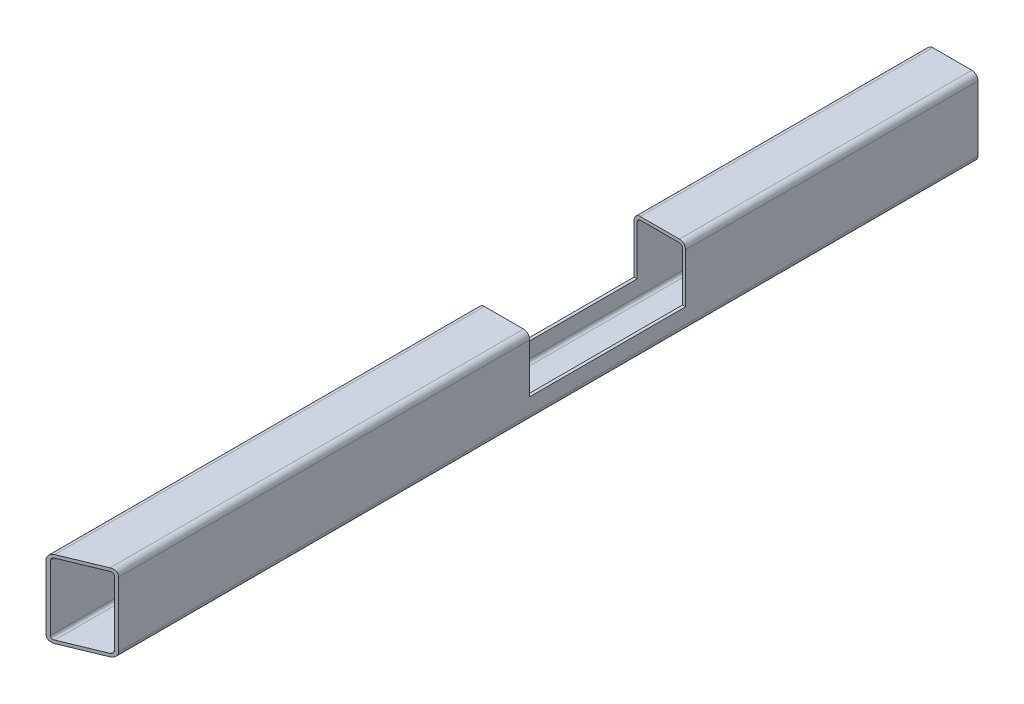
ISO-10303-21;
HEADER;
FILE_DESCRIPTION(('STEP AP214'),'2;1');
FILE_NAME('part.step','',(''),(''),'','','');
FILE_SCHEMA(('AUTOMOTIVE_DESIGN { 1 0 10303 214 1 1 1 1 }'));
ENDSEC;
DATA;
#1=APPLICATION_CONTEXT('core data for automotive mechanical design processes');
#2=APPLICATION_PROTOCOL_DEFINITION('international standard','automotive_design',2000,#1);
#3=PRODUCT_CONTEXT('',#1,'mechanical');
#4=PRODUCT('Part','Part','',(#3));
#5=PRODUCT_RELATED_PRODUCT_CATEGORY('part','',(#4));
#6=PRODUCT_DEFINITION_FORMATION('','',#4);
#7=PRODUCT_DEFINITION_CONTEXT('part definition',#1,'design');
#8=PRODUCT_DEFINITION('design','',#6,#7);
#9=PRODUCT_DEFINITION_SHAPE('','',#8);
#10=(LENGTH_UNIT() NAMED_UNIT(*) SI_UNIT(.MILLI.,.METRE.));
#11=(NAMED_UNIT(*) PLANE_ANGLE_UNIT() SI_UNIT($,.RADIAN.));
#12=(NAMED_UNIT(*) SI_UNIT($,.STERADIAN.) SOLID_ANGLE_UNIT());
#13=UNCERTAINTY_MEASURE_WITH_UNIT(LENGTH_MEASURE(1.E-05),#10,'distance_accuracy_value','');
#14=(GEOMETRIC_REPRESENTATION_CONTEXT(3) GLOBAL_UNCERTAINTY_ASSIGNED_CONTEXT((#13)) GLOBAL_UNIT_ASSIGNED_CONTEXT((#10,
#11,#12)) REPRESENTATION_CONTEXT('',''));
#15=CARTESIAN_POINT('',(0.,0.,0.));
#16=DIRECTION('',(0.,0.,1.));
#17=DIRECTION('',(1.,0.,0.));
#18=AXIS2_PLACEMENT_3D('',#15,#16,#17);
#19=CARTESIAN_POINT('',(56.87568,70.12432,869.95));
#20=DIRECTION('',(0.,0.,-1.));
#21=DIRECTION('',(1.,0.,0.));
#22=AXIS2_PLACEMENT_3D('',#19,#20,#21);
#23=CYLINDRICAL_SURFACE('',#22,6.07568);
#24=DIRECTION('',(0.,0.,-1.));
#25=VECTOR('',#24,1.);
#26=CARTESIAN_POINT('',(56.87568,76.2,869.95));
#27=LINE('',#26,#25);
#28=CARTESIAN_POINT('',(56.8756800000001,76.2,288.925));
#29=VERTEX_POINT('',#28);
#30=CARTESIAN_POINT('',(56.87568,76.2,0.));
#31=VERTEX_POINT('',#30);
#32=EDGE_CURVE('E245',#29,#31,#27,.T.);
#33=ORIENTED_EDGE('',*,*,#32,.T.);
#34=CARTESIAN_POINT('',(56.87568,70.12432,0.));
#35=DIRECTION('',(0.,0.,-1.));
#36=DIRECTION('',(1.,0.,0.));
#37=AXIS2_PLACEMENT_3D('',#34,#35,#36);
#38=CIRCLE('',#37,6.07568);
#39=CARTESIAN_POINT('',(50.8,70.12432,0.));
#40=VERTEX_POINT('',#39);
#41=EDGE_CURVE('E365',#40,#31,#38,.T.);
#42=ORIENTED_EDGE('',*,*,#41,.F.);
#43=DIRECTION('',(0.,0.,-1.));
#44=VECTOR('',#43,1.);
#45=CARTESIAN_POINT('',(50.8,70.12432,869.95));
#46=LINE('',#45,#44);
#47=CARTESIAN_POINT('',(50.8,70.12432,288.925));
#48=VERTEX_POINT('',#47);
#49=EDGE_CURVE('E244',#48,#40,#46,.T.);
#50=ORIENTED_EDGE('',*,*,#49,.F.);
#51=CARTESIAN_POINT('',(56.87568,70.12432,288.925));
#52=DIRECTION('',(0.,0.,1.));
#53=DIRECTION('',(1.,0.,0.));
#54=AXIS2_PLACEMENT_3D('',#51,#52,#53);
#55=CIRCLE('',#54,6.07568);
#56=EDGE_CURVE('E307',#29,#48,#55,.T.);
#57=ORIENTED_EDGE('',*,*,#56,.F.);
#58=EDGE_LOOP('',(#33,#42,#50,#57));
#59=FACE_BOUND('',#58,.T.);
#60=ADVANCED_FACE('F37',(#59),#23,.T.);
#61=CARTESIAN_POINT('',(95.52432,76.2,869.95));
#62=DIRECTION('',(0.,-1.,0.));
#63=DIRECTION('',(0.,0.,-1.));
#64=AXIS2_PLACEMENT_3D('',#61,#62,#63);
#65=PLANE('',#64);
#66=DIRECTION('',(0.,0.,-1.));
#67=VECTOR('',#66,1.);
#68=CARTESIAN_POINT('',(95.52432,76.2,869.95));
#69=LINE('',#68,#67);
#70=CARTESIAN_POINT('',(95.52432,76.2,288.925));
#71=VERTEX_POINT('',#70);
#72=CARTESIAN_POINT('',(95.52432,76.2,0.));
#73=VERTEX_POINT('',#72);
#74=EDGE_CURVE('E379',#71,#73,#69,.T.);
#75=ORIENTED_EDGE('',*,*,#74,.T.);
#76=DIRECTION('',(1.,0.,0.));
#77=VECTOR('',#76,1.);
#78=CARTESIAN_POINT('',(95.52432,76.2,0.));
#79=LINE('',#78,#77);
#80=EDGE_CURVE('E368',#31,#73,#79,.T.);
#81=ORIENTED_EDGE('',*,*,#80,.F.);
#82=ORIENTED_EDGE('',*,*,#32,.F.);
#83=DIRECTION('',(-1.,0.,0.));
#84=VECTOR('',#83,1.);
#85=CARTESIAN_POINT('',(920.75,76.2,288.925));
#86=LINE('',#85,#84);
#87=EDGE_CURVE('E403',#71,#29,#86,.T.);
#88=ORIENTED_EDGE('',*,*,#87,.F.);
#89=EDGE_LOOP('',(#75,#81,#82,#88));
#90=FACE_BOUND('',#89,.T.);
#91=ADVANCED_FACE('F402',(#90),#65,.F.);
#92=CARTESIAN_POINT('',(95.52432,70.12432,869.95));
#93=DIRECTION('',(0.,0.,-1.));
#94=DIRECTION('',(1.,0.,0.));
#95=AXIS2_PLACEMENT_3D('',#92,#93,#94);
#96=CYLINDRICAL_SURFACE('',#95,6.07568);
#97=DIRECTION('',(0.,0.,-1.));
#98=VECTOR('',#97,1.);
#99=CARTESIAN_POINT('',(101.6,70.12432,869.95));
#100=LINE('',#99,#98);
#101=CARTESIAN_POINT('',(101.6,70.12432,288.925));
#102=VERTEX_POINT('',#101);
#103=CARTESIAN_POINT('',(101.6,70.12432,0.));
#104=VERTEX_POINT('',#103);
#105=EDGE_CURVE('E376',#102,#104,#100,.T.);
#106=ORIENTED_EDGE('',*,*,#105,.T.);
#107=CARTESIAN_POINT('',(95.52432,70.12432,0.));
#108=DIRECTION('',(0.,0.,-1.));
#109=DIRECTION('',(1.,0.,0.));
#110=AXIS2_PLACEMENT_3D('',#107,#108,#109);
#111=CIRCLE('',#110,6.07568);
#112=EDGE_CURVE('E371',#73,#104,#111,.T.);
#113=ORIENTED_EDGE('',*,*,#112,.F.);
#114=ORIENTED_EDGE('',*,*,#74,.F.);
#115=CARTESIAN_POINT('',(95.52432,70.12432,288.925));
#116=DIRECTION('',(0.,0.,1.));
#117=DIRECTION('',(1.,0.,0.));
#118=AXIS2_PLACEMENT_3D('',#115,#116,#117);
#119=CIRCLE('',#118,6.07568);
#120=EDGE_CURVE('E305',#102,#71,#119,.T.);
#121=ORIENTED_EDGE('',*,*,#120,.F.);
#122=EDGE_LOOP('',(#106,#113,#114,#121));
#123=FACE_BOUND('',#122,.T.);
#124=ADVANCED_FACE('F387',(#123),#96,.T.);
#125=CARTESIAN_POINT('',(56.87568,70.12432,869.95));
#126=DIRECTION('',(0.,0.,-1.));
#127=DIRECTION('',(1.,0.,0.));
#128=AXIS2_PLACEMENT_3D('',#125,#126,#127);
#129=CYLINDRICAL_SURFACE('',#128,3.03784);
#130=CARTESIAN_POINT('',(56.87568,70.12432,288.925));
#131=DIRECTION('',(0.,0.,1.));
#132=DIRECTION('',(1.,0.,0.));
#133=AXIS2_PLACEMENT_3D('',#130,#131,#132);
#134=CIRCLE('',#133,3.03784);
#135=CARTESIAN_POINT('',(56.87568,73.16216,288.925));
#136=VERTEX_POINT('',#135);
#137=CARTESIAN_POINT('',(53.83784,70.12432,288.925));
#138=VERTEX_POINT('',#137);
#139=EDGE_CURVE('E291',#136,#138,#134,.T.);
#140=ORIENTED_EDGE('',*,*,#139,.T.);
#141=DIRECTION('',(0.,0.,-1.));
#142=VECTOR('',#141,1.);
#143=CARTESIAN_POINT('',(53.83784,70.12432,869.95));
#144=LINE('',#143,#142);
#145=CARTESIAN_POINT('',(53.83784,70.12432,0.));
#146=VERTEX_POINT('',#145);
#147=EDGE_CURVE('E340',#138,#146,#144,.T.);
#148=ORIENTED_EDGE('',*,*,#147,.T.);
#149=CARTESIAN_POINT('',(56.87568,70.12432,0.));
#150=DIRECTION('',(0.,0.,-1.));
#151=DIRECTION('',(1.,0.,0.));
#152=AXIS2_PLACEMENT_3D('',#149,#150,#151);
#153=CIRCLE('',#152,3.03784);
#154=CARTESIAN_POINT('',(56.87568,73.16216,0.));
#155=VERTEX_POINT('',#154);
#156=EDGE_CURVE('E321',#146,#155,#153,.T.);
#157=ORIENTED_EDGE('',*,*,#156,.T.);
#158=DIRECTION('',(0.,0.,-1.));
#159=VECTOR('',#158,1.);
#160=CARTESIAN_POINT('',(56.87568,73.16216,869.95));
#161=LINE('',#160,#159);
#162=EDGE_CURVE('E336',#136,#155,#161,.T.);
#163=ORIENTED_EDGE('',*,*,#162,.F.);
#164=EDGE_LOOP('',(#140,#148,#157,#163));
#165=FACE_BOUND('',#164,.T.);
#166=ADVANCED_FACE('F547',(#165),#129,.F.);
#167=CARTESIAN_POINT('',(95.52432,73.16216,869.95));
#168=DIRECTION('',(0.,-1.,0.));
#169=DIRECTION('',(0.,0.,-1.));
#170=AXIS2_PLACEMENT_3D('',#167,#168,#169);
#171=PLANE('',#170);
#172=DIRECTION('',(-1.,0.,0.));
#173=VECTOR('',#172,1.);
#174=CARTESIAN_POINT('',(95.52432,73.16216,288.925));
#175=LINE('',#174,#173);
#176=CARTESIAN_POINT('',(95.52432,73.16216,288.925));
#177=VERTEX_POINT('',#176);
#178=EDGE_CURVE('E288',#177,#136,#175,.T.);
#179=ORIENTED_EDGE('',*,*,#178,.T.);
#180=ORIENTED_EDGE('',*,*,#162,.T.);
#181=DIRECTION('',(1.,0.,0.));
#182=VECTOR('',#181,1.);
#183=CARTESIAN_POINT('',(95.52432,73.16216,0.));
#184=LINE('',#183,#182);
#185=CARTESIAN_POINT('',(95.52432,73.16216,0.));
#186=VERTEX_POINT('',#185);
#187=EDGE_CURVE('E324',#155,#186,#184,.T.);
#188=ORIENTED_EDGE('',*,*,#187,.T.);
#189=DIRECTION('',(0.,0.,-1.));
#190=VECTOR('',#189,1.);
#191=CARTESIAN_POINT('',(95.52432,73.16216,869.95));
#192=LINE('',#191,#190);
#193=EDGE_CURVE('E332',#177,#186,#192,.T.);
#194=ORIENTED_EDGE('',*,*,#193,.F.);
#195=EDGE_LOOP('',(#179,#180,#188,#194));
#196=FACE_BOUND('',#195,.T.);
#197=ADVANCED_FACE('F549',(#196),#171,.T.);
#198=CARTESIAN_POINT('',(95.52432,70.12432,869.95));
#199=DIRECTION('',(0.,0.,-1.));
#200=DIRECTION('',(1.,0.,0.));
#201=AXIS2_PLACEMENT_3D('',#198,#199,#200);
#202=CYLINDRICAL_SURFACE('',#201,3.03784);
#203=CARTESIAN_POINT('',(95.52432,70.12432,288.925));
#204=DIRECTION('',(0.,0.,1.));
#205=DIRECTION('',(1.,0.,0.));
#206=AXIS2_PLACEMENT_3D('',#203,#204,#205);
#207=CIRCLE('',#206,3.03784);
#208=CARTESIAN_POINT('',(98.56216,70.12432,288.925));
#209=VERTEX_POINT('',#208);
#210=EDGE_CURVE('E279',#209,#177,#207,.T.);
#211=ORIENTED_EDGE('',*,*,#210,.T.);
#212=ORIENTED_EDGE('',*,*,#193,.T.);
#213=CARTESIAN_POINT('',(95.52432,70.12432,0.));
#214=DIRECTION('',(0.,0.,-1.));
#215=DIRECTION('',(1.,0.,0.));
#216=AXIS2_PLACEMENT_3D('',#213,#214,#215);
#217=CIRCLE('',#216,3.03784);
#218=CARTESIAN_POINT('',(98.56216,70.12432,0.));
#219=VERTEX_POINT('',#218);
#220=EDGE_CURVE('E281',#186,#219,#217,.T.);
#221=ORIENTED_EDGE('',*,*,#220,.T.);
#222=DIRECTION('',(0.,0.,-1.));
#223=VECTOR('',#222,1.);
#224=CARTESIAN_POINT('',(98.56216,70.12432,869.95));
#225=LINE('',#224,#223);
#226=EDGE_CURVE('E271',#209,#219,#225,.T.);
#227=ORIENTED_EDGE('',*,*,#226,.F.);
#228=EDGE_LOOP('',(#211,#212,#221,#227));
#229=FACE_BOUND('',#228,.T.);
#230=ADVANCED_FACE('F277',(#229),#202,.F.);
#231=CARTESIAN_POINT('',(95.52432,6.07568,0.));
#232=DIRECTION('',(0.,0.,-1.));
#233=DIRECTION('',(1.,0.,0.));
#234=AXIS2_PLACEMENT_3D('',#231,#232,#233);
#235=PLANE('',#234);
#236=CARTESIAN_POINT('',(95.52432,6.07568,0.));
#237=DIRECTION('',(0.,0.,-1.));
#238=DIRECTION('',(1.,0.,0.));
#239=AXIS2_PLACEMENT_3D('',#236,#237,#238);
#240=CIRCLE('',#239,6.07568);
#241=CARTESIAN_POINT('',(101.6,6.07568000000004,0.));
#242=VERTEX_POINT('',#241);
#243=CARTESIAN_POINT('',(95.52432,0.,0.));
#244=VERTEX_POINT('',#243);
#245=EDGE_CURVE('E350',#242,#244,#240,.T.);
#246=ORIENTED_EDGE('',*,*,#245,.T.);
#247=DIRECTION('',(-1.,0.,0.));
#248=VECTOR('',#247,1.);
#249=CARTESIAN_POINT('',(95.52432,0.,0.));
#250=LINE('',#249,#248);
#251=CARTESIAN_POINT('',(56.87568,0.,0.));
#252=VERTEX_POINT('',#251);
#253=EDGE_CURVE('E357',#244,#252,#250,.T.);
#254=ORIENTED_EDGE('',*,*,#253,.T.);
#255=CARTESIAN_POINT('',(56.87568,6.07568,0.));
#256=DIRECTION('',(0.,0.,-1.));
#257=DIRECTION('',(-1.,0.,0.));
#258=AXIS2_PLACEMENT_3D('',#255,#256,#257);
#259=CIRCLE('',#258,6.07568);
#260=CARTESIAN_POINT('',(50.8,6.07568,0.));
#261=VERTEX_POINT('',#260);
#262=EDGE_CURVE('E360',#252,#261,#259,.T.);
#263=ORIENTED_EDGE('',*,*,#262,.T.);
#264=DIRECTION('',(0.,1.,0.));
#265=VECTOR('',#264,1.);
#266=CARTESIAN_POINT('',(50.8,6.07568000000004,0.));
#267=LINE('',#266,#265);
#268=EDGE_CURVE('E363',#261,#40,#267,.T.);
#269=ORIENTED_EDGE('',*,*,#268,.T.);
#270=ORIENTED_EDGE('',*,*,#41,.T.);
#271=ORIENTED_EDGE('',*,*,#80,.T.);
#272=ORIENTED_EDGE('',*,*,#112,.T.);
#273=DIRECTION('',(0.,-1.,0.));
#274=VECTOR('',#273,1.);
#275=CARTESIAN_POINT('',(101.6,6.07568000000004,0.));
#276=LINE('',#275,#274);
#277=EDGE_CURVE('E354',#104,#242,#276,.T.);
#278=ORIENTED_EDGE('',*,*,#277,.T.);
#279=EDGE_LOOP('',(#246,#254,#263,#269,#270,#271,#272,#278));
#280=FACE_BOUND('',#279,.T.);
#281=DIRECTION('',(0.,-1.,0.));
#282=VECTOR('',#281,1.);
#283=CARTESIAN_POINT('',(98.56216,6.07568000000004,0.));
#284=LINE('',#283,#282);
#285=CARTESIAN_POINT('',(98.56216,6.07568000000004,0.));
#286=VERTEX_POINT('',#285);
#287=EDGE_CURVE('E328',#219,#286,#284,.T.);
#288=ORIENTED_EDGE('',*,*,#287,.F.);
#289=ORIENTED_EDGE('',*,*,#220,.F.);
#290=ORIENTED_EDGE('',*,*,#187,.F.);
#291=ORIENTED_EDGE('',*,*,#156,.F.);
#292=DIRECTION('',(0.,1.,0.));
#293=VECTOR('',#292,1.);
#294=CARTESIAN_POINT('',(53.83784,6.07568000000004,0.));
#295=LINE('',#294,#293);
#296=CARTESIAN_POINT('',(53.83784,6.07568000000004,0.));
#297=VERTEX_POINT('',#296);
#298=EDGE_CURVE('E319',#297,#146,#295,.T.);
#299=ORIENTED_EDGE('',*,*,#298,.F.);
#300=CARTESIAN_POINT('',(56.87568,6.07568,0.));
#301=DIRECTION('',(0.,0.,-1.));
#302=DIRECTION('',(-1.,0.,0.));
#303=AXIS2_PLACEMENT_3D('',#300,#301,#302);
#304=CIRCLE('',#303,3.03784);
#305=CARTESIAN_POINT('',(56.87568,3.03784,0.));
#306=VERTEX_POINT('',#305);
#307=EDGE_CURVE('E316',#306,#297,#304,.T.);
#308=ORIENTED_EDGE('',*,*,#307,.F.);
#309=DIRECTION('',(-1.,0.,0.));
#310=VECTOR('',#309,1.);
#311=CARTESIAN_POINT('',(95.52432,3.03784,0.));
#312=LINE('',#311,#310);
#313=CARTESIAN_POINT('',(95.52432,3.03784,0.));
#314=VERTEX_POINT('',#313);
#315=EDGE_CURVE('E313',#314,#306,#312,.T.);
#316=ORIENTED_EDGE('',*,*,#315,.F.);
#317=CARTESIAN_POINT('',(95.52432,6.07568,0.));
#318=DIRECTION('',(0.,0.,-1.));
#319=DIRECTION('',(1.,0.,0.));
#320=AXIS2_PLACEMENT_3D('',#317,#318,#319);
#321=CIRCLE('',#320,3.03784);
#322=EDGE_CURVE('E310',#286,#314,#321,.T.);
#323=ORIENTED_EDGE('',*,*,#322,.F.);
#324=EDGE_LOOP('',(#288,#289,#290,#291,#299,#308,#316,#323));
#325=FACE_BOUND('',#324,.T.);
#326=ADVANCED_FACE('F396',(#280,#325),#235,.T.);
#327=CARTESIAN_POINT('',(95.52432,6.07568,869.95));
#328=DIRECTION('',(0.,0.,-1.));
#329=DIRECTION('',(1.,0.,0.));
#330=AXIS2_PLACEMENT_3D('',#327,#328,#329);
#331=CYLINDRICAL_SURFACE('',#330,6.07568);
#332=DIRECTION('',(0.,0.,-1.));
#333=VECTOR('',#332,1.);
#334=CARTESIAN_POINT('',(95.52432,0.,869.95));
#335=LINE('',#334,#333);
#336=CARTESIAN_POINT('',(95.5243199999999,0.,851.424580088086));
#337=VERTEX_POINT('',#336);
#338=EDGE_CURVE('E258',#337,#244,#335,.T.);
#339=ORIENTED_EDGE('',*,*,#338,.T.);
#340=ORIENTED_EDGE('',*,*,#245,.F.);
#341=DIRECTION('',(0.,0.,-1.));
#342=VECTOR('',#341,1.);
#343=CARTESIAN_POINT('',(101.6,6.07568000000004,869.95));
#344=LINE('',#343,#342);
#345=CARTESIAN_POINT('',(101.6,6.07568000000004,848.907951031447));
#346=VERTEX_POINT('',#345);
#347=EDGE_CURVE('E353',#346,#242,#344,.T.);
#348=ORIENTED_EDGE('',*,*,#347,.F.);
#349=CARTESIAN_POINT('',(95.52432,6.07568,851.424580088086));
#350=DIRECTION('',(0.382683432365084,0.,0.923879532511289));
#351=DIRECTION('',(0.923879532511289,0.,-0.382683432365084));
#352=AXIS2_PLACEMENT_3D('',#349,#350,#351);
#353=ELLIPSE('',#352,6.57626864347248,6.07568);
#354=EDGE_CURVE('E478',#337,#346,#353,.T.);
#355=ORIENTED_EDGE('',*,*,#354,.F.);
#356=EDGE_LOOP('',(#339,#340,#348,#355));
#357=FACE_BOUND('',#356,.T.);
#358=ADVANCED_FACE('F39',(#357),#331,.T.);
#359=CARTESIAN_POINT('',(95.52432,0.,869.95));
#360=DIRECTION('',(0.,1.,0.));
#361=DIRECTION('',(0.,0.,1.));
#362=AXIS2_PLACEMENT_3D('',#359,#360,#361);
#363=PLANE('',#362);
#364=DIRECTION('',(0.,0.,-1.));
#365=VECTOR('',#364,1.);
#366=CARTESIAN_POINT('',(56.87568,0.,869.95));
#367=LINE('',#366,#365);
#368=CARTESIAN_POINT('',(56.87568,0.,867.433370943361));
#369=VERTEX_POINT('',#368);
#370=EDGE_CURVE('E256',#369,#252,#367,.T.);
#371=ORIENTED_EDGE('',*,*,#370,.T.);
#372=ORIENTED_EDGE('',*,*,#253,.F.);
#373=ORIENTED_EDGE('',*,*,#338,.F.);
#374=DIRECTION('',(0.923879532511289,0.,-0.382683432365084));
#375=VECTOR('',#374,1.);
#376=CARTESIAN_POINT('',(50.8,0.,869.95));
#377=LINE('',#376,#375);
#378=EDGE_CURVE('E229',#369,#337,#377,.T.);
#379=ORIENTED_EDGE('',*,*,#378,.F.);
#380=EDGE_LOOP('',(#371,#372,#373,#379));
#381=FACE_BOUND('',#380,.T.);
#382=ADVANCED_FACE('F503',(#381),#363,.F.);
#383=CARTESIAN_POINT('',(56.87568,6.07568,869.95));
#384=DIRECTION('',(0.,0.,-1.));
#385=DIRECTION('',(1.,0.,0.));
#386=AXIS2_PLACEMENT_3D('',#383,#384,#385);
#387=CYLINDRICAL_SURFACE('',#386,6.07568);
#388=DIRECTION('',(0.,0.,-1.));
#389=VECTOR('',#388,1.);
#390=CARTESIAN_POINT('',(50.8,6.07568,869.95));
#391=LINE('',#390,#389);
#392=CARTESIAN_POINT('',(50.8,6.07568,869.95));
#393=VERTEX_POINT('',#392);
#394=EDGE_CURVE('E254',#393,#261,#391,.T.);
#395=ORIENTED_EDGE('',*,*,#394,.T.);
#396=ORIENTED_EDGE('',*,*,#262,.F.);
#397=ORIENTED_EDGE('',*,*,#370,.F.);
#398=CARTESIAN_POINT('',(56.87568,6.07568,867.433370943361));
#399=DIRECTION('',(0.382683432365084,0.,0.923879532511289));
#400=DIRECTION('',(0.923879532511289,0.,-0.382683432365084));
#401=AXIS2_PLACEMENT_3D('',#398,#399,#400);
#402=ELLIPSE('',#401,6.57626864347248,6.07568);
#403=EDGE_CURVE('E238',#393,#369,#402,.T.);
#404=ORIENTED_EDGE('',*,*,#403,.F.);
#405=EDGE_LOOP('',(#395,#396,#397,#404));
#406=FACE_BOUND('',#405,.T.);
#407=ADVANCED_FACE('F499',(#406),#387,.T.);
#408=CARTESIAN_POINT('',(50.8,6.07568000000004,869.95));
#409=DIRECTION('',(1.,0.,0.));
#410=DIRECTION('',(0.,0.,1.));
#411=AXIS2_PLACEMENT_3D('',#408,#409,#410);
#412=PLANE('',#411);
#413=ORIENTED_EDGE('',*,*,#49,.T.);
#414=ORIENTED_EDGE('',*,*,#268,.F.);
#415=ORIENTED_EDGE('',*,*,#394,.F.);
#416=DIRECTION('',(0.,1.,0.));
#417=VECTOR('',#416,1.);
#418=CARTESIAN_POINT('',(50.8,6.07568000000004,869.95));
#419=LINE('',#418,#417);
#420=CARTESIAN_POINT('',(50.8,70.12432,869.95));
#421=VERTEX_POINT('',#420);
#422=EDGE_CURVE('E351',#393,#421,#419,.T.);
#423=ORIENTED_EDGE('',*,*,#422,.T.);
#424=CARTESIAN_POINT('',(50.8,70.12432,442.849));
#425=VERTEX_POINT('',#424);
#426=EDGE_CURVE('E236',#421,#425,#46,.T.);
#427=ORIENTED_EDGE('',*,*,#426,.T.);
#428=DIRECTION('',(0.,-1.,0.));
#429=VECTOR('',#428,1.);
#430=CARTESIAN_POINT('',(50.8,21.336,442.849));
#431=LINE('',#430,#429);
#432=CARTESIAN_POINT('',(50.8,21.336,442.849));
#433=VERTEX_POINT('',#432);
#434=EDGE_CURVE('E480',#425,#433,#431,.T.);
#435=ORIENTED_EDGE('',*,*,#434,.T.);
#436=DIRECTION('',(0.,0.,-1.));
#437=VECTOR('',#436,1.);
#438=CARTESIAN_POINT('',(50.8,21.336,288.925));
#439=LINE('',#438,#437);
#440=CARTESIAN_POINT('',(50.8,21.336,288.925));
#441=VERTEX_POINT('',#440);
#442=EDGE_CURVE('E448',#433,#441,#439,.T.);
#443=ORIENTED_EDGE('',*,*,#442,.T.);
#444=DIRECTION('',(0.,1.,0.));
#445=VECTOR('',#444,1.);
#446=CARTESIAN_POINT('',(50.8,76.2,288.925));
#447=LINE('',#446,#445);
#448=EDGE_CURVE('E414',#441,#48,#447,.T.);
#449=ORIENTED_EDGE('',*,*,#448,.T.);
#450=EDGE_LOOP('',(#413,#414,#415,#423,#427,#435,#443,#449));
#451=FACE_BOUND('',#450,.T.);
#452=ADVANCED_FACE('F482',(#451),#412,.F.);
#453=CARTESIAN_POINT('',(56.87568,76.2,867.433370943361));
#454=VERTEX_POINT('',#453);
#455=CARTESIAN_POINT('',(56.8756800000001,76.2,442.849));
#456=VERTEX_POINT('',#455);
#457=EDGE_CURVE('E234',#454,#456,#27,.T.);
#458=ORIENTED_EDGE('',*,*,#457,.T.);
#459=CARTESIAN_POINT('',(56.87568,70.12432,442.849));
#460=DIRECTION('',(0.,0.,-1.));
#461=DIRECTION('',(-1.,0.,0.));
#462=AXIS2_PLACEMENT_3D('',#459,#460,#461);
#463=CIRCLE('',#462,6.07568);
#464=EDGE_CURVE('E435',#425,#456,#463,.T.);
#465=ORIENTED_EDGE('',*,*,#464,.F.);
#466=ORIENTED_EDGE('',*,*,#426,.F.);
#467=CARTESIAN_POINT('',(56.87568,70.12432,867.433370943361));
#468=DIRECTION('',(0.382683432365084,0.,0.923879532511289));
#469=DIRECTION('',(0.923879532511289,0.,-0.382683432365084));
#470=AXIS2_PLACEMENT_3D('',#467,#468,#469);
#471=ELLIPSE('',#470,6.57626864347248,6.07568);
#472=EDGE_CURVE('E222',#454,#421,#471,.T.);
#473=ORIENTED_EDGE('',*,*,#472,.F.);
#474=EDGE_LOOP('',(#458,#465,#466,#473));
#475=FACE_BOUND('',#474,.T.);
#476=ADVANCED_FACE('F233',(#475),#23,.T.);
#477=CARTESIAN_POINT('',(95.52432,76.2,851.424580088086));
#478=VERTEX_POINT('',#477);
#479=CARTESIAN_POINT('',(95.52432,76.2,442.849));
#480=VERTEX_POINT('',#479);
#481=EDGE_CURVE('E250',#478,#480,#69,.T.);
#482=ORIENTED_EDGE('',*,*,#481,.T.);
#483=DIRECTION('',(-1.,0.,0.));
#484=VECTOR('',#483,1.);
#485=CARTESIAN_POINT('',(920.75,76.2,442.849));
#486=LINE('',#485,#484);
#487=EDGE_CURVE('E242',#480,#456,#486,.T.);
#488=ORIENTED_EDGE('',*,*,#487,.T.);
#489=ORIENTED_EDGE('',*,*,#457,.F.);
#490=DIRECTION('',(0.923879532511289,0.,-0.382683432365084));
#491=VECTOR('',#490,1.);
#492=CARTESIAN_POINT('',(50.8,76.2,869.95));
#493=LINE('',#492,#491);
#494=EDGE_CURVE('E219',#454,#478,#493,.T.);
#495=ORIENTED_EDGE('',*,*,#494,.T.);
#496=EDGE_LOOP('',(#482,#488,#489,#495));
#497=FACE_BOUND('',#496,.T.);
#498=ADVANCED_FACE('F240',(#497),#65,.F.);
#499=CARTESIAN_POINT('',(101.6,70.12432,848.907951031447));
#500=VERTEX_POINT('',#499);
#501=CARTESIAN_POINT('',(101.6,70.12432,442.849));
#502=VERTEX_POINT('',#501);
#503=EDGE_CURVE('E377',#500,#502,#100,.T.);
#504=ORIENTED_EDGE('',*,*,#503,.T.);
#505=CARTESIAN_POINT('',(95.52432,70.12432,442.849));
#506=DIRECTION('',(0.,0.,-1.));
#507=DIRECTION('',(-1.,0.,0.));
#508=AXIS2_PLACEMENT_3D('',#505,#506,#507);
#509=CIRCLE('',#508,6.07568);
#510=EDGE_CURVE('E432',#480,#502,#509,.T.);
#511=ORIENTED_EDGE('',*,*,#510,.F.);
#512=ORIENTED_EDGE('',*,*,#481,.F.);
#513=CARTESIAN_POINT('',(95.52432,70.12432,851.424580088086));
#514=DIRECTION('',(0.382683432365084,0.,0.923879532511289));
#515=DIRECTION('',(0.923879532511289,0.,-0.382683432365084));
#516=AXIS2_PLACEMENT_3D('',#513,#514,#515);
#517=ELLIPSE('',#516,6.57626864347248,6.07568);
#518=EDGE_CURVE('E224',#500,#478,#517,.T.);
#519=ORIENTED_EDGE('',*,*,#518,.F.);
#520=EDGE_LOOP('',(#504,#511,#512,#519));
#521=FACE_BOUND('',#520,.T.);
#522=ADVANCED_FACE('F498',(#521),#96,.T.);
#523=CARTESIAN_POINT('',(101.6,6.07568000000004,869.95));
#524=DIRECTION('',(-1.,0.,0.));
#525=DIRECTION('',(0.,0.,-1.));
#526=AXIS2_PLACEMENT_3D('',#523,#524,#525);
#527=PLANE('',#526);
#528=ORIENTED_EDGE('',*,*,#347,.T.);
#529=ORIENTED_EDGE('',*,*,#277,.F.);
#530=ORIENTED_EDGE('',*,*,#105,.F.);
#531=DIRECTION('',(0.,1.,0.));
#532=VECTOR('',#531,1.);
#533=CARTESIAN_POINT('',(101.6,6.07568000000004,288.925));
#534=LINE('',#533,#532);
#535=CARTESIAN_POINT('',(101.6,21.336,288.925));
#536=VERTEX_POINT('',#535);
#537=EDGE_CURVE('E303',#536,#102,#534,.T.);
#538=ORIENTED_EDGE('',*,*,#537,.F.);
#539=DIRECTION('',(0.,0.,-1.));
#540=VECTOR('',#539,1.);
#541=CARTESIAN_POINT('',(101.6,21.3359999999999,869.95));
#542=LINE('',#541,#540);
#543=CARTESIAN_POINT('',(101.6,21.336,442.849));
#544=VERTEX_POINT('',#543);
#545=EDGE_CURVE('E289',#544,#536,#542,.T.);
#546=ORIENTED_EDGE('',*,*,#545,.F.);
#547=DIRECTION('',(0.,-1.,0.));
#548=VECTOR('',#547,1.);
#549=CARTESIAN_POINT('',(101.6,6.07568000000004,442.849));
#550=LINE('',#549,#548);
#551=EDGE_CURVE('E429',#502,#544,#550,.T.);
#552=ORIENTED_EDGE('',*,*,#551,.F.);
#553=ORIENTED_EDGE('',*,*,#503,.F.);
#554=DIRECTION('',(0.,1.,0.));
#555=VECTOR('',#554,1.);
#556=CARTESIAN_POINT('',(101.6,0.,848.907951031447));
#557=LINE('',#556,#555);
#558=EDGE_CURVE('E52',#346,#500,#557,.T.);
#559=ORIENTED_EDGE('',*,*,#558,.F.);
#560=EDGE_LOOP('',(#528,#529,#530,#538,#546,#552,#553,#559));
#561=FACE_BOUND('',#560,.T.);
#562=ADVANCED_FACE('F391',(#561),#527,.F.);
#563=CARTESIAN_POINT('',(95.52432,6.07568,869.95));
#564=DIRECTION('',(0.,0.,-1.));
#565=DIRECTION('',(1.,0.,0.));
#566=AXIS2_PLACEMENT_3D('',#563,#564,#565);
#567=CYLINDRICAL_SURFACE('',#566,3.03784);
#568=CARTESIAN_POINT('',(95.52432,6.07568,851.424580088086));
#569=DIRECTION('',(0.382683432365084,0.,0.923879532511289));
#570=DIRECTION('',(0.923879532511289,0.,-0.382683432365084));
#571=AXIS2_PLACEMENT_3D('',#568,#569,#570);
#572=ELLIPSE('',#571,3.28813432173624,3.03784);
#573=CARTESIAN_POINT('',(95.52432,3.03784,851.424580088086));
#574=VERTEX_POINT('',#573);
#575=CARTESIAN_POINT('',(98.56216,6.07568000000004,850.166265559767));
#576=VERTEX_POINT('',#575);
#577=EDGE_CURVE('E473',#574,#576,#572,.T.);
#578=ORIENTED_EDGE('',*,*,#577,.T.);
#579=DIRECTION('',(0.,0.,-1.));
#580=VECTOR('',#579,1.);
#581=CARTESIAN_POINT('',(98.56216,6.07568000000004,869.95));
#582=LINE('',#581,#580);
#583=EDGE_CURVE('E283',#576,#286,#582,.T.);
#584=ORIENTED_EDGE('',*,*,#583,.T.);
#585=ORIENTED_EDGE('',*,*,#322,.T.);
#586=DIRECTION('',(0.,0.,-1.));
#587=VECTOR('',#586,1.);
#588=CARTESIAN_POINT('',(95.52432,3.03784,869.95));
#589=LINE('',#588,#587);
#590=EDGE_CURVE('E348',#574,#314,#589,.T.);
#591=ORIENTED_EDGE('',*,*,#590,.F.);
#592=EDGE_LOOP('',(#578,#584,#585,#591));
#593=FACE_BOUND('',#592,.T.);
#594=ADVANCED_FACE('F533',(#593),#567,.F.);
#595=CARTESIAN_POINT('',(95.52432,3.03784,869.95));
#596=DIRECTION('',(0.,1.,0.));
#597=DIRECTION('',(0.,0.,1.));
#598=AXIS2_PLACEMENT_3D('',#595,#596,#597);
#599=PLANE('',#598);
#600=DIRECTION('',(0.923879532511289,0.,-0.382683432365084));
#601=VECTOR('',#600,1.);
#602=CARTESIAN_POINT('',(88.9745949779787,3.03784,854.137565022022));
#603=LINE('',#602,#601);
#604=CARTESIAN_POINT('',(56.87568,3.03784,867.433370943361));
#605=VERTEX_POINT('',#604);
#606=EDGE_CURVE('E466',#605,#574,#603,.T.);
#607=ORIENTED_EDGE('',*,*,#606,.T.);
#608=ORIENTED_EDGE('',*,*,#590,.T.);
#609=ORIENTED_EDGE('',*,*,#315,.T.);
#610=DIRECTION('',(0.,0.,-1.));
#611=VECTOR('',#610,1.);
#612=CARTESIAN_POINT('',(56.87568,3.03784,869.95));
#613=LINE('',#612,#611);
#614=EDGE_CURVE('E346',#605,#306,#613,.T.);
#615=ORIENTED_EDGE('',*,*,#614,.F.);
#616=EDGE_LOOP('',(#607,#608,#609,#615));
#617=FACE_BOUND('',#616,.T.);
#618=ADVANCED_FACE('F536',(#617),#599,.T.);
#619=CARTESIAN_POINT('',(56.87568,6.07568,869.95));
#620=DIRECTION('',(0.,0.,-1.));
#621=DIRECTION('',(1.,0.,0.));
#622=AXIS2_PLACEMENT_3D('',#619,#620,#621);
#623=CYLINDRICAL_SURFACE('',#622,3.03784);
#624=CARTESIAN_POINT('',(56.87568,6.07568,867.433370943361));
#625=DIRECTION('',(0.382683432365084,0.,0.923879532511289));
#626=DIRECTION('',(0.923879532511289,0.,-0.382683432365084));
#627=AXIS2_PLACEMENT_3D('',#624,#625,#626);
#628=ELLIPSE('',#627,3.28813432173624,3.03784);
#629=CARTESIAN_POINT('',(53.83784,6.07568000000004,868.691685471681));
#630=VERTEX_POINT('',#629);
#631=EDGE_CURVE('E464',#630,#605,#628,.T.);
#632=ORIENTED_EDGE('',*,*,#631,.T.);
#633=ORIENTED_EDGE('',*,*,#614,.T.);
#634=ORIENTED_EDGE('',*,*,#307,.T.);
#635=DIRECTION('',(0.,0.,-1.));
#636=VECTOR('',#635,1.);
#637=CARTESIAN_POINT('',(53.83784,6.07568000000004,869.95));
#638=LINE('',#637,#636);
#639=EDGE_CURVE('E344',#630,#297,#638,.T.);
#640=ORIENTED_EDGE('',*,*,#639,.F.);
#641=EDGE_LOOP('',(#632,#633,#634,#640));
#642=FACE_BOUND('',#641,.T.);
#643=ADVANCED_FACE('F540',(#642),#623,.F.);
#644=CARTESIAN_POINT('',(53.83784,6.07568000000004,869.95));
#645=DIRECTION('',(1.,0.,0.));
#646=DIRECTION('',(0.,0.,1.));
#647=AXIS2_PLACEMENT_3D('',#644,#645,#646);
#648=PLANE('',#647);
#649=DIRECTION('',(0.,-1.,0.));
#650=VECTOR('',#649,1.);
#651=CARTESIAN_POINT('',(53.83784,6.07568000000004,868.691685471681));
#652=LINE('',#651,#650);
#653=CARTESIAN_POINT('',(53.83784,70.12432,868.691685471681));
#654=VERTEX_POINT('',#653);
#655=EDGE_CURVE('E459',#654,#630,#652,.T.);
#656=ORIENTED_EDGE('',*,*,#655,.T.);
#657=ORIENTED_EDGE('',*,*,#639,.T.);
#658=ORIENTED_EDGE('',*,*,#298,.T.);
#659=ORIENTED_EDGE('',*,*,#147,.F.);
#660=DIRECTION('',(0.,-1.,0.));
#661=VECTOR('',#660,1.);
#662=CARTESIAN_POINT('',(53.83784,6.07568000000004,288.925));
#663=LINE('',#662,#661);
#664=CARTESIAN_POINT('',(53.83784,21.336,288.925));
#665=VERTEX_POINT('',#664);
#666=EDGE_CURVE('E300',#138,#665,#663,.T.);
#667=ORIENTED_EDGE('',*,*,#666,.T.);
#668=DIRECTION('',(0.,0.,1.));
#669=VECTOR('',#668,1.);
#670=CARTESIAN_POINT('',(53.83784,21.3359999999999,869.95));
#671=LINE('',#670,#669);
#672=CARTESIAN_POINT('',(53.83784,21.336,442.849));
#673=VERTEX_POINT('',#672);
#674=EDGE_CURVE('E294',#665,#673,#671,.T.);
#675=ORIENTED_EDGE('',*,*,#674,.T.);
#676=DIRECTION('',(0.,1.,0.));
#677=VECTOR('',#676,1.);
#678=CARTESIAN_POINT('',(53.83784,6.07568000000004,442.849));
#679=LINE('',#678,#677);
#680=CARTESIAN_POINT('',(53.83784,70.12432,442.849));
#681=VERTEX_POINT('',#680);
#682=EDGE_CURVE('E426',#673,#681,#679,.T.);
#683=ORIENTED_EDGE('',*,*,#682,.T.);
#684=EDGE_CURVE('E341',#654,#681,#144,.T.);
#685=ORIENTED_EDGE('',*,*,#684,.F.);
#686=EDGE_LOOP('',(#656,#657,#658,#659,#667,#675,#683,#685));
#687=FACE_BOUND('',#686,.T.);
#688=ADVANCED_FACE('F439',(#687),#648,.T.);
#689=CARTESIAN_POINT('',(56.87568,70.12432,867.433370943361));
#690=DIRECTION('',(0.382683432365084,0.,0.923879532511289));
#691=DIRECTION('',(0.923879532511289,0.,-0.382683432365084));
#692=AXIS2_PLACEMENT_3D('',#689,#690,#691);
#693=ELLIPSE('',#692,3.28813432173624,3.03784);
#694=CARTESIAN_POINT('',(56.87568,73.16216,867.433370943361));
#695=VERTEX_POINT('',#694);
#696=EDGE_CURVE('E457',#695,#654,#693,.T.);
#697=ORIENTED_EDGE('',*,*,#696,.T.);
#698=ORIENTED_EDGE('',*,*,#684,.T.);
#699=CARTESIAN_POINT('',(56.87568,70.12432,442.849));
#700=DIRECTION('',(0.,0.,-1.));
#701=DIRECTION('',(-1.,0.,0.));
#702=AXIS2_PLACEMENT_3D('',#699,#700,#701);
#703=CIRCLE('',#702,3.03784);
#704=CARTESIAN_POINT('',(56.87568,73.16216,442.849));
#705=VERTEX_POINT('',#704);
#706=EDGE_CURVE('E423',#681,#705,#703,.T.);
#707=ORIENTED_EDGE('',*,*,#706,.T.);
#708=EDGE_CURVE('E337',#695,#705,#161,.T.);
#709=ORIENTED_EDGE('',*,*,#708,.F.);
#710=EDGE_LOOP('',(#697,#698,#707,#709));
#711=FACE_BOUND('',#710,.T.);
#712=ADVANCED_FACE('F455',(#711),#129,.F.);
#713=DIRECTION('',(-0.923879532511289,0.,0.382683432365084));
#714=VECTOR('',#713,1.);
#715=CARTESIAN_POINT('',(88.9745949779787,73.16216,854.137565022022));
#716=LINE('',#715,#714);
#717=CARTESIAN_POINT('',(95.52432,73.16216,851.424580088086));
#718=VERTEX_POINT('',#717);
#719=EDGE_CURVE('E468',#718,#695,#716,.T.);
#720=ORIENTED_EDGE('',*,*,#719,.T.);
#721=ORIENTED_EDGE('',*,*,#708,.T.);
#722=DIRECTION('',(1.,0.,0.));
#723=VECTOR('',#722,1.);
#724=CARTESIAN_POINT('',(95.52432,73.16216,442.849));
#725=LINE('',#724,#723);
#726=CARTESIAN_POINT('',(95.52432,73.16216,442.849));
#727=VERTEX_POINT('',#726);
#728=EDGE_CURVE('E409',#705,#727,#725,.T.);
#729=ORIENTED_EDGE('',*,*,#728,.T.);
#730=EDGE_CURVE('E333',#718,#727,#192,.T.);
#731=ORIENTED_EDGE('',*,*,#730,.F.);
#732=EDGE_LOOP('',(#720,#721,#729,#731));
#733=FACE_BOUND('',#732,.T.);
#734=ADVANCED_FACE('F526',(#733),#171,.T.);
#735=CARTESIAN_POINT('',(95.52432,70.12432,851.424580088086));
#736=DIRECTION('',(0.382683432365084,0.,0.923879532511289));
#737=DIRECTION('',(0.923879532511289,0.,-0.382683432365084));
#738=AXIS2_PLACEMENT_3D('',#735,#736,#737);
#739=ELLIPSE('',#738,3.28813432173624,3.03784);
#740=CARTESIAN_POINT('',(98.56216,70.12432,850.166265559767));
#741=VERTEX_POINT('',#740);
#742=EDGE_CURVE('E521',#741,#718,#739,.T.);
#743=ORIENTED_EDGE('',*,*,#742,.T.);
#744=ORIENTED_EDGE('',*,*,#730,.T.);
#745=CARTESIAN_POINT('',(95.52432,70.12432,442.849));
#746=DIRECTION('',(0.,0.,-1.));
#747=DIRECTION('',(-1.,0.,0.));
#748=AXIS2_PLACEMENT_3D('',#745,#746,#747);
#749=CIRCLE('',#748,3.03784);
#750=CARTESIAN_POINT('',(98.56216,70.12432,442.849));
#751=VERTEX_POINT('',#750);
#752=EDGE_CURVE('E405',#727,#751,#749,.T.);
#753=ORIENTED_EDGE('',*,*,#752,.T.);
#754=EDGE_CURVE('E282',#741,#751,#225,.T.);
#755=ORIENTED_EDGE('',*,*,#754,.F.);
#756=EDGE_LOOP('',(#743,#744,#753,#755));
#757=FACE_BOUND('',#756,.T.);
#758=ADVANCED_FACE('F529',(#757),#202,.F.);
#759=CARTESIAN_POINT('',(98.56216,6.07568000000004,869.95));
#760=DIRECTION('',(-1.,0.,0.));
#761=DIRECTION('',(0.,0.,-1.));
#762=AXIS2_PLACEMENT_3D('',#759,#760,#761);
#763=PLANE('',#762);
#764=DIRECTION('',(0.,1.,0.));
#765=VECTOR('',#764,1.);
#766=CARTESIAN_POINT('',(98.56216,6.07568000000004,850.166265559767));
#767=LINE('',#766,#765);
#768=EDGE_CURVE('E11',#576,#741,#767,.T.);
#769=ORIENTED_EDGE('',*,*,#768,.T.);
#770=ORIENTED_EDGE('',*,*,#754,.T.);
#771=DIRECTION('',(0.,-1.,0.));
#772=VECTOR('',#771,1.);
#773=CARTESIAN_POINT('',(98.56216,6.07568000000004,442.849));
#774=LINE('',#773,#772);
#775=CARTESIAN_POINT('',(98.56216,21.336,442.849));
#776=VERTEX_POINT('',#775);
#777=EDGE_CURVE('E260',#751,#776,#774,.T.);
#778=ORIENTED_EDGE('',*,*,#777,.T.);
#779=DIRECTION('',(0.,0.,-1.));
#780=VECTOR('',#779,1.);
#781=CARTESIAN_POINT('',(98.56216,21.3359999999999,869.95));
#782=LINE('',#781,#780);
#783=CARTESIAN_POINT('',(98.56216,21.336,288.925));
#784=VERTEX_POINT('',#783);
#785=EDGE_CURVE('E263',#776,#784,#782,.T.);
#786=ORIENTED_EDGE('',*,*,#785,.T.);
#787=DIRECTION('',(0.,1.,0.));
#788=VECTOR('',#787,1.);
#789=CARTESIAN_POINT('',(98.56216,6.07568000000004,288.925));
#790=LINE('',#789,#788);
#791=EDGE_CURVE('E45',#784,#209,#790,.T.);
#792=ORIENTED_EDGE('',*,*,#791,.T.);
#793=ORIENTED_EDGE('',*,*,#226,.T.);
#794=ORIENTED_EDGE('',*,*,#287,.T.);
#795=ORIENTED_EDGE('',*,*,#583,.F.);
#796=EDGE_LOOP('',(#769,#770,#778,#786,#792,#793,#794,#795));
#797=FACE_BOUND('',#796,.T.);
#798=ADVANCED_FACE('F269',(#797),#763,.T.);
#799=CARTESIAN_POINT('',(920.75,76.2,288.925));
#800=DIRECTION('',(0.,0.,-1.));
#801=DIRECTION('',(1.,0.,0.));
#802=AXIS2_PLACEMENT_3D('',#799,#800,#801);
#803=PLANE('',#802);
#804=ORIENTED_EDGE('',*,*,#87,.T.);
#805=ORIENTED_EDGE('',*,*,#56,.T.);
#806=ORIENTED_EDGE('',*,*,#448,.F.);
#807=DIRECTION('',(-1.,0.,0.));
#808=VECTOR('',#807,1.);
#809=CARTESIAN_POINT('',(920.75,21.336,288.925));
#810=LINE('',#809,#808);
#811=EDGE_CURVE('E411',#665,#441,#810,.T.);
#812=ORIENTED_EDGE('',*,*,#811,.F.);
#813=ORIENTED_EDGE('',*,*,#666,.F.);
#814=ORIENTED_EDGE('',*,*,#139,.F.);
#815=ORIENTED_EDGE('',*,*,#178,.F.);
#816=ORIENTED_EDGE('',*,*,#210,.F.);
#817=ORIENTED_EDGE('',*,*,#791,.F.);
#818=EDGE_CURVE('E406',#536,#784,#810,.T.);
#819=ORIENTED_EDGE('',*,*,#818,.F.);
#820=ORIENTED_EDGE('',*,*,#537,.T.);
#821=ORIENTED_EDGE('',*,*,#120,.T.);
#822=EDGE_LOOP('',(#804,#805,#806,#812,#813,#814,#815,#816,#817,#819,#820,#821));
#823=FACE_BOUND('',#822,.T.);
#824=ADVANCED_FACE('F286',(#823),#803,.F.);
#825=CARTESIAN_POINT('',(920.75,21.336,288.925));
#826=DIRECTION('',(0.,-1.,0.));
#827=DIRECTION('',(0.,0.,-1.));
#828=AXIS2_PLACEMENT_3D('',#825,#826,#827);
#829=PLANE('',#828);
#830=DIRECTION('',(-1.,0.,0.));
#831=VECTOR('',#830,1.);
#832=CARTESIAN_POINT('',(920.75,21.336,442.849));
#833=LINE('',#832,#831);
#834=EDGE_CURVE('E417',#544,#776,#833,.T.);
#835=ORIENTED_EDGE('',*,*,#834,.F.);
#836=ORIENTED_EDGE('',*,*,#545,.T.);
#837=ORIENTED_EDGE('',*,*,#818,.T.);
#838=ORIENTED_EDGE('',*,*,#785,.F.);
#839=EDGE_LOOP('',(#835,#836,#837,#838));
#840=FACE_BOUND('',#839,.T.);
#841=ADVANCED_FACE('F701',(#840),#829,.F.);
#842=ORIENTED_EDGE('',*,*,#674,.F.);
#843=ORIENTED_EDGE('',*,*,#811,.T.);
#844=ORIENTED_EDGE('',*,*,#442,.F.);
#845=EDGE_CURVE('E418',#673,#433,#833,.T.);
#846=ORIENTED_EDGE('',*,*,#845,.F.);
#847=EDGE_LOOP('',(#842,#843,#844,#846));
#848=FACE_BOUND('',#847,.T.);
#849=ADVANCED_FACE('F444',(#848),#829,.F.);
#850=CARTESIAN_POINT('',(920.75,21.336,442.849));
#851=DIRECTION('',(0.,0.,1.));
#852=DIRECTION('',(-1.,0.,0.));
#853=AXIS2_PLACEMENT_3D('',#850,#851,#852);
#854=PLANE('',#853);
#855=ORIENTED_EDGE('',*,*,#434,.F.);
#856=ORIENTED_EDGE('',*,*,#464,.T.);
#857=ORIENTED_EDGE('',*,*,#487,.F.);
#858=ORIENTED_EDGE('',*,*,#510,.T.);
#859=ORIENTED_EDGE('',*,*,#551,.T.);
#860=ORIENTED_EDGE('',*,*,#834,.T.);
#861=ORIENTED_EDGE('',*,*,#777,.F.);
#862=ORIENTED_EDGE('',*,*,#752,.F.);
#863=ORIENTED_EDGE('',*,*,#728,.F.);
#864=ORIENTED_EDGE('',*,*,#706,.F.);
#865=ORIENTED_EDGE('',*,*,#682,.F.);
#866=ORIENTED_EDGE('',*,*,#845,.T.);
#867=EDGE_LOOP('',(#855,#856,#857,#858,#859,#860,#861,#862,#863,#864,#865,#866));
#868=FACE_BOUND('',#867,.T.);
#869=ADVANCED_FACE('F452',(#868),#854,.F.);
#870=CARTESIAN_POINT('',(50.8,0.,869.95));
#871=DIRECTION('',(-0.382683432365084,0.,-0.923879532511289));
#872=DIRECTION('',(0.923879532511289,0.,-0.382683432365084));
#873=AXIS2_PLACEMENT_3D('',#870,#871,#872);
#874=PLANE('',#873);
#875=ORIENTED_EDGE('',*,*,#577,.F.);
#876=ORIENTED_EDGE('',*,*,#606,.F.);
#877=ORIENTED_EDGE('',*,*,#631,.F.);
#878=ORIENTED_EDGE('',*,*,#655,.F.);
#879=ORIENTED_EDGE('',*,*,#696,.F.);
#880=ORIENTED_EDGE('',*,*,#719,.F.);
#881=ORIENTED_EDGE('',*,*,#742,.F.);
#882=ORIENTED_EDGE('',*,*,#768,.F.);
#883=EDGE_LOOP('',(#875,#876,#877,#878,#879,#880,#881,#882));
#884=FACE_BOUND('',#883,.T.);
#885=ORIENTED_EDGE('',*,*,#378,.T.);
#886=ORIENTED_EDGE('',*,*,#354,.T.);
#887=ORIENTED_EDGE('',*,*,#558,.T.);
#888=ORIENTED_EDGE('',*,*,#518,.T.);
#889=ORIENTED_EDGE('',*,*,#494,.F.);
#890=ORIENTED_EDGE('',*,*,#472,.T.);
#891=ORIENTED_EDGE('',*,*,#422,.F.);
#892=ORIENTED_EDGE('',*,*,#403,.T.);
#893=EDGE_LOOP('',(#885,#886,#887,#888,#889,#890,#891,#892));
#894=FACE_BOUND('',#893,.T.);
#895=ADVANCED_FACE('F221',(#884,#894),#874,.F.);
#896=CLOSED_SHELL('',(#60,#91,#124,#166,#197,#230,#326,#358,#382,#407,#452,#476,#498,#522,#562,
#594,#618,#643,#688,#712,#734,#758,#798,#824,#841,#849,#869,#895));
#897=MANIFOLD_SOLID_BREP('B2',#896);
#898=ADVANCED_BREP_SHAPE_REPRESENTATION('',(#18,#897),#14);
#899=SHAPE_DEFINITION_REPRESENTATION(#9,#898);
ENDSEC;
END-ISO-10303-21;
